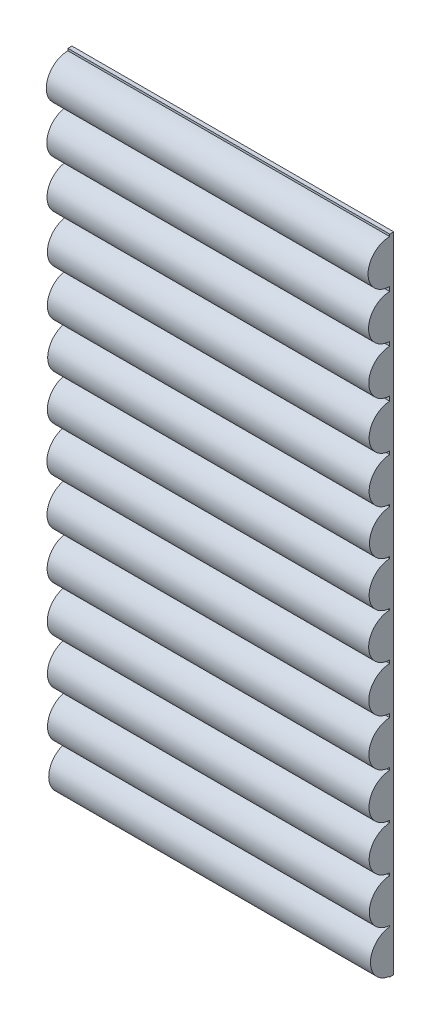
ISO-10303-21;
HEADER;
FILE_DESCRIPTION(('STEP AP214'),'2;1');
FILE_NAME('part.step','',(''),(''),'','','');
FILE_SCHEMA(('AUTOMOTIVE_DESIGN { 1 0 10303 214 1 1 1 1 }'));
ENDSEC;
DATA;
#1=APPLICATION_CONTEXT('core data for automotive mechanical design processes');
#2=APPLICATION_PROTOCOL_DEFINITION('international standard','automotive_design',2000,#1);
#3=PRODUCT_CONTEXT('',#1,'mechanical');
#4=PRODUCT('Part','Part','',(#3));
#5=PRODUCT_RELATED_PRODUCT_CATEGORY('part','',(#4));
#6=PRODUCT_DEFINITION_FORMATION('','',#4);
#7=PRODUCT_DEFINITION_CONTEXT('part definition',#1,'design');
#8=PRODUCT_DEFINITION('design','',#6,#7);
#9=PRODUCT_DEFINITION_SHAPE('','',#8);
#10=(LENGTH_UNIT() NAMED_UNIT(*) SI_UNIT(.MILLI.,.METRE.));
#11=(NAMED_UNIT(*) PLANE_ANGLE_UNIT() SI_UNIT($,.RADIAN.));
#12=(NAMED_UNIT(*) SI_UNIT($,.STERADIAN.) SOLID_ANGLE_UNIT());
#13=UNCERTAINTY_MEASURE_WITH_UNIT(LENGTH_MEASURE(1.E-05),#10,'distance_accuracy_value','');
#14=(GEOMETRIC_REPRESENTATION_CONTEXT(3) GLOBAL_UNCERTAINTY_ASSIGNED_CONTEXT((#13)) GLOBAL_UNIT_ASSIGNED_CONTEXT((#10,
#11,#12)) REPRESENTATION_CONTEXT('',''));
#15=CARTESIAN_POINT('',(0.,0.,0.));
#16=DIRECTION('',(0.,0.,1.));
#17=DIRECTION('',(1.,0.,0.));
#18=AXIS2_PLACEMENT_3D('',#15,#16,#17);
#19=CARTESIAN_POINT('',(0.,0.,0.026));
#20=DIRECTION('',(0.,0.,-1.));
#21=DIRECTION('',(-1.,0.,0.));
#22=AXIS2_PLACEMENT_3D('',#19,#20,#21);
#23=PLANE('',#22);
#24=DIRECTION('',(0.,1.,0.));
#25=VECTOR('',#24,1.);
#26=CARTESIAN_POINT('',(2.08,0.,0.026));
#27=LINE('',#26,#25);
#28=CARTESIAN_POINT('',(2.08,0.,0.026));
#29=VERTEX_POINT('',#28);
#30=CARTESIAN_POINT('',(2.08,0.00484128205017573,0.026));
#31=VERTEX_POINT('',#30);
#32=EDGE_CURVE('E259',#29,#31,#27,.T.);
#33=ORIENTED_EDGE('',*,*,#32,.T.);
#34=DIRECTION('',(-1.,0.,0.));
#35=VECTOR('',#34,1.);
#36=CARTESIAN_POINT('',(2.39228025314519,0.00484128205017573,0.026));
#37=LINE('',#36,#35);
#38=CARTESIAN_POINT('',(0.,0.00484128205017573,0.026));
#39=VERTEX_POINT('',#38);
#40=EDGE_CURVE('E55',#31,#39,#37,.T.);
#41=ORIENTED_EDGE('',*,*,#40,.T.);
#42=DIRECTION('',(0.,-1.,0.));
#43=VECTOR('',#42,1.);
#44=CARTESIAN_POINT('',(0.,0.,0.026));
#45=LINE('',#44,#43);
#46=CARTESIAN_POINT('',(0.,0.,0.026));
#47=VERTEX_POINT('',#46);
#48=EDGE_CURVE('E477',#39,#47,#45,.T.);
#49=ORIENTED_EDGE('',*,*,#48,.T.);
#50=DIRECTION('',(1.,0.,0.));
#51=VECTOR('',#50,1.);
#52=CARTESIAN_POINT('',(0.,0.,0.026));
#53=LINE('',#52,#51);
#54=EDGE_CURVE('E475',#47,#29,#53,.T.);
#55=ORIENTED_EDGE('',*,*,#54,.T.);
#56=EDGE_LOOP('',(#33,#41,#49,#55));
#57=FACE_BOUND('',#56,.T.);
#58=ADVANCED_FACE('F39',(#57),#23,.F.);
#59=CARTESIAN_POINT('',(0.,0.289570039081242,0.026));
#60=VERTEX_POINT('',#59);
#61=CARTESIAN_POINT('',(0.,0.282403177707025,0.026));
#62=VERTEX_POINT('',#61);
#63=EDGE_CURVE('E63',#60,#62,#45,.T.);
#64=ORIENTED_EDGE('',*,*,#63,.T.);
#65=DIRECTION('',(-1.,0.,0.));
#66=VECTOR('',#65,1.);
#67=CARTESIAN_POINT('',(2.39228025314519,0.282403177707025,0.026));
#68=LINE('',#67,#66);
#69=CARTESIAN_POINT('',(2.08,0.282403177707025,0.026));
#70=VERTEX_POINT('',#69);
#71=EDGE_CURVE('E262',#62,#70,#68,.F.);
#72=ORIENTED_EDGE('',*,*,#71,.T.);
#73=CARTESIAN_POINT('',(2.08,0.289570039081242,0.026));
#74=VERTEX_POINT('',#73);
#75=EDGE_CURVE('E250',#70,#74,#27,.T.);
#76=ORIENTED_EDGE('',*,*,#75,.T.);
#77=DIRECTION('',(-1.,0.,0.));
#78=VECTOR('',#77,1.);
#79=CARTESIAN_POINT('',(2.39228025314519,0.289570039081242,0.026));
#80=LINE('',#79,#78);
#81=EDGE_CURVE('E288',#74,#60,#80,.T.);
#82=ORIENTED_EDGE('',*,*,#81,.T.);
#83=EDGE_LOOP('',(#64,#72,#76,#82));
#84=FACE_BOUND('',#83,.T.);
#85=ADVANCED_FACE('F263',(#84),#23,.F.);
#86=CARTESIAN_POINT('',(0.,0.584806109365343,0.026));
#87=VERTEX_POINT('',#86);
#88=CARTESIAN_POINT('',(0.,0.568456082298236,0.026));
#89=VERTEX_POINT('',#88);
#90=EDGE_CURVE('E591',#87,#89,#45,.T.);
#91=ORIENTED_EDGE('',*,*,#90,.T.);
#92=DIRECTION('',(-1.,0.,0.));
#93=VECTOR('',#92,1.);
#94=CARTESIAN_POINT('',(2.39228025314519,0.568456082298236,0.026));
#95=LINE('',#94,#93);
#96=CARTESIAN_POINT('',(2.08,0.568456082298236,0.026));
#97=VERTEX_POINT('',#96);
#98=EDGE_CURVE('E281',#89,#97,#95,.F.);
#99=ORIENTED_EDGE('',*,*,#98,.T.);
#100=CARTESIAN_POINT('',(2.08,0.584806109365343,0.026));
#101=VERTEX_POINT('',#100);
#102=EDGE_CURVE('E260',#97,#101,#27,.T.);
#103=ORIENTED_EDGE('',*,*,#102,.T.);
#104=DIRECTION('',(-1.,0.,0.));
#105=VECTOR('',#104,1.);
#106=CARTESIAN_POINT('',(2.39228025314519,0.584806109365343,0.026));
#107=LINE('',#106,#105);
#108=EDGE_CURVE('E303',#101,#87,#107,.T.);
#109=ORIENTED_EDGE('',*,*,#108,.T.);
#110=EDGE_LOOP('',(#91,#99,#103,#109));
#111=FACE_BOUND('',#110,.T.);
#112=ADVANCED_FACE('F578',(#111),#23,.F.);
#113=CARTESIAN_POINT('',(0.,0.878608154204701,0.026));
#114=VERTEX_POINT('',#113);
#115=CARTESIAN_POINT('',(0.,0.86375738478695,0.026));
#116=VERTEX_POINT('',#115);
#117=EDGE_CURVE('E589',#114,#116,#45,.T.);
#118=ORIENTED_EDGE('',*,*,#117,.T.);
#119=DIRECTION('',(-1.,0.,0.));
#120=VECTOR('',#119,1.);
#121=CARTESIAN_POINT('',(2.39228025314519,0.86375738478695,0.026));
#122=LINE('',#121,#120);
#123=CARTESIAN_POINT('',(2.08,0.86375738478695,0.026));
#124=VERTEX_POINT('',#123);
#125=EDGE_CURVE('E296',#116,#124,#122,.F.);
#126=ORIENTED_EDGE('',*,*,#125,.T.);
#127=CARTESIAN_POINT('',(2.08,0.878608154204701,0.026));
#128=VERTEX_POINT('',#127);
#129=EDGE_CURVE('E569',#124,#128,#27,.T.);
#130=ORIENTED_EDGE('',*,*,#129,.T.);
#131=DIRECTION('',(-1.,0.,0.));
#132=VECTOR('',#131,1.);
#133=CARTESIAN_POINT('',(2.39228025314519,0.878608154204701,0.026));
#134=LINE('',#133,#132);
#135=EDGE_CURVE('E318',#128,#114,#134,.T.);
#136=ORIENTED_EDGE('',*,*,#135,.T.);
#137=EDGE_LOOP('',(#118,#126,#130,#136));
#138=FACE_BOUND('',#137,.T.);
#139=ADVANCED_FACE('F587',(#138),#23,.F.);
#140=CARTESIAN_POINT('',(0.,1.17368885080481,0.026));
#141=VERTEX_POINT('',#140);
#142=CARTESIAN_POINT('',(0.,1.15767194286982,0.026));
#143=VERTEX_POINT('',#142);
#144=EDGE_CURVE('E596',#141,#143,#45,.T.);
#145=ORIENTED_EDGE('',*,*,#144,.T.);
#146=DIRECTION('',(-1.,0.,0.));
#147=VECTOR('',#146,1.);
#148=CARTESIAN_POINT('',(2.39228025314519,1.15767194286982,0.026));
#149=LINE('',#148,#147);
#150=CARTESIAN_POINT('',(2.08,1.15767194286982,0.026));
#151=VERTEX_POINT('',#150);
#152=EDGE_CURVE('E311',#143,#151,#149,.F.);
#153=ORIENTED_EDGE('',*,*,#152,.T.);
#154=CARTESIAN_POINT('',(2.08,1.17368885080481,0.026));
#155=VERTEX_POINT('',#154);
#156=EDGE_CURVE('E565',#151,#155,#27,.T.);
#157=ORIENTED_EDGE('',*,*,#156,.T.);
#158=DIRECTION('',(-1.,0.,0.));
#159=VECTOR('',#158,1.);
#160=CARTESIAN_POINT('',(2.39228025314519,1.17368885080481,0.026));
#161=LINE('',#160,#159);
#162=EDGE_CURVE('E333',#155,#141,#161,.T.);
#163=ORIENTED_EDGE('',*,*,#162,.T.);
#164=EDGE_LOOP('',(#145,#153,#157,#163));
#165=FACE_BOUND('',#164,.T.);
#166=ADVANCED_FACE('F667',(#165),#23,.F.);
#167=CARTESIAN_POINT('',(0.,1.47659323640001,0.026));
#168=VERTEX_POINT('',#167);
#169=CARTESIAN_POINT('',(0.,1.4528024800924,0.026));
#170=VERTEX_POINT('',#169);
#171=EDGE_CURVE('E658',#168,#170,#45,.T.);
#172=ORIENTED_EDGE('',*,*,#171,.T.);
#173=DIRECTION('',(-1.,0.,0.));
#174=VECTOR('',#173,1.);
#175=CARTESIAN_POINT('',(2.39228025314519,1.4528024800924,0.026));
#176=LINE('',#175,#174);
#177=CARTESIAN_POINT('',(2.08,1.4528024800924,0.026));
#178=VERTEX_POINT('',#177);
#179=EDGE_CURVE('E326',#170,#178,#176,.F.);
#180=ORIENTED_EDGE('',*,*,#179,.T.);
#181=CARTESIAN_POINT('',(2.08,1.47659323640001,0.026));
#182=VERTEX_POINT('',#181);
#183=EDGE_CURVE('E561',#178,#182,#27,.T.);
#184=ORIENTED_EDGE('',*,*,#183,.T.);
#185=DIRECTION('',(-1.,0.,0.));
#186=VECTOR('',#185,1.);
#187=CARTESIAN_POINT('',(2.39228025314519,1.47659323640001,0.026));
#188=LINE('',#187,#186);
#189=EDGE_CURVE('E348',#182,#168,#188,.T.);
#190=ORIENTED_EDGE('',*,*,#189,.T.);
#191=EDGE_LOOP('',(#172,#180,#184,#190));
#192=FACE_BOUND('',#191,.T.);
#193=ADVANCED_FACE('F878',(#192),#23,.F.);
#194=CARTESIAN_POINT('',(0.,1.77574322886679,0.026));
#195=VERTEX_POINT('',#194);
#196=CARTESIAN_POINT('',(0.,1.75575949501821,0.026));
#197=VERTEX_POINT('',#196);
#198=EDGE_CURVE('E654',#195,#197,#45,.T.);
#199=ORIENTED_EDGE('',*,*,#198,.T.);
#200=DIRECTION('',(-1.,0.,0.));
#201=VECTOR('',#200,1.);
#202=CARTESIAN_POINT('',(2.39228025314519,1.75575949501821,0.026));
#203=LINE('',#202,#201);
#204=CARTESIAN_POINT('',(2.08,1.75575949501821,0.026));
#205=VERTEX_POINT('',#204);
#206=EDGE_CURVE('E341',#197,#205,#203,.F.);
#207=ORIENTED_EDGE('',*,*,#206,.T.);
#208=CARTESIAN_POINT('',(2.08,1.77574322886679,0.026));
#209=VERTEX_POINT('',#208);
#210=EDGE_CURVE('E557',#205,#209,#27,.T.);
#211=ORIENTED_EDGE('',*,*,#210,.T.);
#212=DIRECTION('',(-1.,0.,0.));
#213=VECTOR('',#212,1.);
#214=CARTESIAN_POINT('',(2.39228025314519,1.77574322886679,0.026));
#215=LINE('',#214,#213);
#216=EDGE_CURVE('E363',#209,#195,#215,.T.);
#217=ORIENTED_EDGE('',*,*,#216,.T.);
#218=EDGE_LOOP('',(#199,#207,#211,#217));
#219=FACE_BOUND('',#218,.T.);
#220=ADVANCED_FACE('F871',(#219),#23,.F.);
#221=CARTESIAN_POINT('',(0.,2.06450520931542,0.026));
#222=VERTEX_POINT('',#221);
#223=CARTESIAN_POINT('',(0.,2.05495401224712,0.026));
#224=VERTEX_POINT('',#223);
#225=EDGE_CURVE('E650',#222,#224,#45,.T.);
#226=ORIENTED_EDGE('',*,*,#225,.T.);
#227=DIRECTION('',(-1.,0.,0.));
#228=VECTOR('',#227,1.);
#229=CARTESIAN_POINT('',(2.39228025314519,2.05495401224712,0.026));
#230=LINE('',#229,#228);
#231=CARTESIAN_POINT('',(2.08,2.05495401224712,0.026));
#232=VERTEX_POINT('',#231);
#233=EDGE_CURVE('E356',#224,#232,#230,.F.);
#234=ORIENTED_EDGE('',*,*,#233,.T.);
#235=CARTESIAN_POINT('',(2.08,2.06450520931542,0.026));
#236=VERTEX_POINT('',#235);
#237=EDGE_CURVE('E553',#232,#236,#27,.T.);
#238=ORIENTED_EDGE('',*,*,#237,.T.);
#239=DIRECTION('',(-1.,0.,0.));
#240=VECTOR('',#239,1.);
#241=CARTESIAN_POINT('',(2.39228025314519,2.06450520931542,0.026));
#242=LINE('',#241,#240);
#243=EDGE_CURVE('E378',#236,#222,#242,.T.);
#244=ORIENTED_EDGE('',*,*,#243,.T.);
#245=EDGE_LOOP('',(#226,#234,#238,#244));
#246=FACE_BOUND('',#245,.T.);
#247=ADVANCED_FACE('F864',(#246),#23,.F.);
#248=CARTESIAN_POINT('',(0.,2.35478484976561,0.026));
#249=VERTEX_POINT('',#248);
#250=CARTESIAN_POINT('',(0.,2.34348924718328,0.026));
#251=VERTEX_POINT('',#250);
#252=EDGE_CURVE('E646',#249,#251,#45,.T.);
#253=ORIENTED_EDGE('',*,*,#252,.T.);
#254=DIRECTION('',(-1.,0.,0.));
#255=VECTOR('',#254,1.);
#256=CARTESIAN_POINT('',(2.39228025314519,2.34348924718328,0.026));
#257=LINE('',#256,#255);
#258=CARTESIAN_POINT('',(2.08,2.34348924718328,0.026));
#259=VERTEX_POINT('',#258);
#260=EDGE_CURVE('E371',#251,#259,#257,.F.);
#261=ORIENTED_EDGE('',*,*,#260,.T.);
#262=CARTESIAN_POINT('',(2.08,2.35478484976561,0.026));
#263=VERTEX_POINT('',#262);
#264=EDGE_CURVE('E549',#259,#263,#27,.T.);
#265=ORIENTED_EDGE('',*,*,#264,.T.);
#266=DIRECTION('',(-1.,0.,0.));
#267=VECTOR('',#266,1.);
#268=CARTESIAN_POINT('',(2.39228025314519,2.35478484976561,0.026));
#269=LINE('',#268,#267);
#270=EDGE_CURVE('E393',#263,#249,#269,.T.);
#271=ORIENTED_EDGE('',*,*,#270,.T.);
#272=EDGE_LOOP('',(#253,#261,#265,#271));
#273=FACE_BOUND('',#272,.T.);
#274=ADVANCED_FACE('F857',(#273),#23,.F.);
#275=CARTESIAN_POINT('',(0.,2.6463125591954,0.026));
#276=VERTEX_POINT('',#275);
#277=CARTESIAN_POINT('',(0.,2.633513578448,0.026));
#278=VERTEX_POINT('',#277);
#279=EDGE_CURVE('E642',#276,#278,#45,.T.);
#280=ORIENTED_EDGE('',*,*,#279,.T.);
#281=DIRECTION('',(-1.,0.,0.));
#282=VECTOR('',#281,1.);
#283=CARTESIAN_POINT('',(2.39228025314519,2.633513578448,0.026));
#284=LINE('',#283,#282);
#285=CARTESIAN_POINT('',(2.08,2.633513578448,0.026));
#286=VERTEX_POINT('',#285);
#287=EDGE_CURVE('E386',#278,#286,#284,.F.);
#288=ORIENTED_EDGE('',*,*,#287,.T.);
#289=CARTESIAN_POINT('',(2.08,2.6463125591954,0.026));
#290=VERTEX_POINT('',#289);
#291=EDGE_CURVE('E545',#286,#290,#27,.T.);
#292=ORIENTED_EDGE('',*,*,#291,.T.);
#293=DIRECTION('',(-1.,0.,0.));
#294=VECTOR('',#293,1.);
#295=CARTESIAN_POINT('',(2.39228025314519,2.6463125591954,0.026));
#296=LINE('',#295,#294);
#297=EDGE_CURVE('E408',#290,#276,#296,.T.);
#298=ORIENTED_EDGE('',*,*,#297,.T.);
#299=EDGE_LOOP('',(#280,#288,#292,#298));
#300=FACE_BOUND('',#299,.T.);
#301=ADVANCED_FACE('F850',(#300),#23,.F.);
#302=CARTESIAN_POINT('',(0.,2.94548481404324,0.026));
#303=VERTEX_POINT('',#302);
#304=CARTESIAN_POINT('',(0.,2.92529659706326,0.026));
#305=VERTEX_POINT('',#304);
#306=EDGE_CURVE('E639',#303,#305,#45,.T.);
#307=ORIENTED_EDGE('',*,*,#306,.T.);
#308=DIRECTION('',(-1.,0.,0.));
#309=VECTOR('',#308,1.);
#310=CARTESIAN_POINT('',(2.39228025314519,2.92529659706326,0.026));
#311=LINE('',#310,#309);
#312=CARTESIAN_POINT('',(2.08,2.92529659706326,0.026));
#313=VERTEX_POINT('',#312);
#314=EDGE_CURVE('E401',#305,#313,#311,.F.);
#315=ORIENTED_EDGE('',*,*,#314,.T.);
#316=CARTESIAN_POINT('',(2.08,2.94548481404324,0.026));
#317=VERTEX_POINT('',#316);
#318=EDGE_CURVE('E541',#313,#317,#27,.T.);
#319=ORIENTED_EDGE('',*,*,#318,.T.);
#320=DIRECTION('',(-1.,0.,0.));
#321=VECTOR('',#320,1.);
#322=CARTESIAN_POINT('',(2.39228025314519,2.94548481404324,0.026));
#323=LINE('',#322,#321);
#324=EDGE_CURVE('E423',#317,#303,#323,.T.);
#325=ORIENTED_EDGE('',*,*,#324,.T.);
#326=EDGE_LOOP('',(#307,#315,#319,#325));
#327=FACE_BOUND('',#326,.T.);
#328=ADVANCED_FACE('F843',(#327),#23,.F.);
#329=CARTESIAN_POINT('',(0.,3.25358622750631,0.026));
#330=VERTEX_POINT('',#329);
#331=CARTESIAN_POINT('',(0.,3.2244688519111,0.026));
#332=VERTEX_POINT('',#331);
#333=EDGE_CURVE('E637',#330,#332,#45,.T.);
#334=ORIENTED_EDGE('',*,*,#333,.T.);
#335=DIRECTION('',(-1.,0.,0.));
#336=VECTOR('',#335,1.);
#337=CARTESIAN_POINT('',(2.39228025314519,3.2244688519111,0.026));
#338=LINE('',#337,#336);
#339=CARTESIAN_POINT('',(2.08,3.2244688519111,0.026));
#340=VERTEX_POINT('',#339);
#341=EDGE_CURVE('E416',#332,#340,#338,.F.);
#342=ORIENTED_EDGE('',*,*,#341,.T.);
#343=CARTESIAN_POINT('',(2.08,3.25358622750631,0.026));
#344=VERTEX_POINT('',#343);
#345=EDGE_CURVE('E537',#340,#344,#27,.T.);
#346=ORIENTED_EDGE('',*,*,#345,.T.);
#347=DIRECTION('',(-1.,0.,0.));
#348=VECTOR('',#347,1.);
#349=CARTESIAN_POINT('',(2.39228025314519,3.25358622750631,0.026));
#350=LINE('',#349,#348);
#351=EDGE_CURVE('E438',#344,#330,#350,.T.);
#352=ORIENTED_EDGE('',*,*,#351,.T.);
#353=EDGE_LOOP('',(#334,#342,#346,#352));
#354=FACE_BOUND('',#353,.T.);
#355=ADVANCED_FACE('F624',(#354),#23,.F.);
#356=CARTESIAN_POINT('',(0.,3.55948320968068,0.026));
#357=VERTEX_POINT('',#356);
#358=CARTESIAN_POINT('',(0.,3.5327524861245,0.026));
#359=VERTEX_POINT('',#358);
#360=EDGE_CURVE('E628',#357,#359,#45,.T.);
#361=ORIENTED_EDGE('',*,*,#360,.T.);
#362=DIRECTION('',(-1.,0.,0.));
#363=VECTOR('',#362,1.);
#364=CARTESIAN_POINT('',(2.39228025314519,3.5327524861245,0.026));
#365=LINE('',#364,#363);
#366=CARTESIAN_POINT('',(2.08,3.5327524861245,0.026));
#367=VERTEX_POINT('',#366);
#368=EDGE_CURVE('E431',#359,#367,#365,.F.);
#369=ORIENTED_EDGE('',*,*,#368,.T.);
#370=CARTESIAN_POINT('',(2.08,3.55948320968068,0.026));
#371=VERTEX_POINT('',#370);
#372=EDGE_CURVE('E534',#367,#371,#27,.T.);
#373=ORIENTED_EDGE('',*,*,#372,.T.);
#374=DIRECTION('',(-1.,0.,0.));
#375=VECTOR('',#374,1.);
#376=CARTESIAN_POINT('',(2.39228025314519,3.55948320968068,0.026));
#377=LINE('',#376,#375);
#378=EDGE_CURVE('E453',#371,#357,#377,.T.);
#379=ORIENTED_EDGE('',*,*,#378,.T.);
#380=EDGE_LOOP('',(#361,#369,#373,#379));
#381=FACE_BOUND('',#380,.T.);
#382=ADVANCED_FACE('F620',(#381),#23,.F.);
#383=CARTESIAN_POINT('',(0.,3.86689167334904,0.026));
#384=VERTEX_POINT('',#383);
#385=CARTESIAN_POINT('',(0.,3.8387304171314,0.026));
#386=VERTEX_POINT('',#385);
#387=EDGE_CURVE('E476',#384,#386,#45,.T.);
#388=ORIENTED_EDGE('',*,*,#387,.T.);
#389=DIRECTION('',(-1.,0.,0.));
#390=VECTOR('',#389,1.);
#391=CARTESIAN_POINT('',(2.39228025314519,3.8387304171314,0.026));
#392=LINE('',#391,#390);
#393=CARTESIAN_POINT('',(2.08,3.8387304171314,0.026));
#394=VERTEX_POINT('',#393);
#395=EDGE_CURVE('E446',#386,#394,#392,.F.);
#396=ORIENTED_EDGE('',*,*,#395,.T.);
#397=CARTESIAN_POINT('',(2.08,3.86689167334904,0.026));
#398=VERTEX_POINT('',#397);
#399=EDGE_CURVE('E531',#394,#398,#27,.T.);
#400=ORIENTED_EDGE('',*,*,#399,.T.);
#401=DIRECTION('',(-1.,0.,0.));
#402=VECTOR('',#401,1.);
#403=CARTESIAN_POINT('',(2.39228025314519,3.86689167334904,0.026));
#404=LINE('',#403,#402);
#405=EDGE_CURVE('E462',#398,#384,#404,.T.);
#406=ORIENTED_EDGE('',*,*,#405,.T.);
#407=EDGE_LOOP('',(#388,#396,#400,#406));
#408=FACE_BOUND('',#407,.T.);
#409=ADVANCED_FACE('F605',(#408),#23,.F.);
#410=CARTESIAN_POINT('',(0.,0.,0.026));
#411=DIRECTION('',(1.,0.,0.));
#412=DIRECTION('',(0.,0.,-1.));
#413=AXIS2_PLACEMENT_3D('',#410,#411,#412);
#414=PLANE('',#413);
#415=ORIENTED_EDGE('',*,*,#48,.F.);
#416=CARTESIAN_POINT('',(0.,0.1436222298786,0.0103910339634849));
#417=DIRECTION('',(-1.,0.,0.));
#418=DIRECTION('',(0.,0.,1.));
#419=AXIS2_PLACEMENT_3D('',#416,#417,#418);
#420=CIRCLE('',#419,0.139655974812698);
#421=EDGE_CURVE('E271',#39,#62,#420,.T.);
#422=ORIENTED_EDGE('',*,*,#421,.T.);
#423=ORIENTED_EDGE('',*,*,#63,.F.);
#424=CARTESIAN_POINT('',(0.,0.429013060689739,0.0182905885064299));
#425=DIRECTION('',(-1.,0.,0.));
#426=DIRECTION('',(0.,0.,1.));
#427=AXIS2_PLACEMENT_3D('',#424,#425,#426);
#428=CIRCLE('',#427,0.139655974812698);
#429=EDGE_CURVE('E278',#60,#89,#428,.T.);
#430=ORIENTED_EDGE('',*,*,#429,.T.);
#431=ORIENTED_EDGE('',*,*,#90,.F.);
#432=CARTESIAN_POINT('',(0.,0.724281747076146,0.0189050873120477));
#433=DIRECTION('',(-1.,0.,0.));
#434=DIRECTION('',(0.,0.,1.));
#435=AXIS2_PLACEMENT_3D('',#432,#433,#434);
#436=CIRCLE('',#435,0.139655974812698);
#437=EDGE_CURVE('E291',#87,#116,#436,.T.);
#438=ORIENTED_EDGE('',*,*,#437,.T.);
#439=ORIENTED_EDGE('',*,*,#117,.F.);
#440=CARTESIAN_POINT('',(0.,1.01814004853726,0.0201142744837723));
#441=DIRECTION('',(-1.,0.,0.));
#442=DIRECTION('',(0.,0.,1.));
#443=AXIS2_PLACEMENT_3D('',#440,#441,#442);
#444=CIRCLE('',#443,0.139655974812698);
#445=EDGE_CURVE('E306',#114,#143,#444,.T.);
#446=ORIENTED_EDGE('',*,*,#445,.T.);
#447=ORIENTED_EDGE('',*,*,#144,.F.);
#448=CARTESIAN_POINT('',(0.,1.31324566544861,0.0207381764222741));
#449=DIRECTION('',(-1.,0.,0.));
#450=DIRECTION('',(0.,0.,1.));
#451=AXIS2_PLACEMENT_3D('',#448,#449,#450);
#452=CIRCLE('',#451,0.139655974812698);
#453=EDGE_CURVE('E321',#141,#170,#452,.T.);
#454=ORIENTED_EDGE('',*,*,#453,.T.);
#455=ORIENTED_EDGE('',*,*,#171,.F.);
#456=CARTESIAN_POINT('',(0.,1.61617636570911,0.0214898655048064));
#457=DIRECTION('',(-1.,0.,0.));
#458=DIRECTION('',(0.,0.,1.));
#459=AXIS2_PLACEMENT_3D('',#456,#457,#458);
#460=CIRCLE('',#459,0.139655974812698);
#461=EDGE_CURVE('E336',#168,#197,#460,.T.);
#462=ORIENTED_EDGE('',*,*,#461,.T.);
#463=ORIENTED_EDGE('',*,*,#198,.F.);
#464=CARTESIAN_POINT('',(0.,1.91534862055696,0.0222415545873387));
#465=DIRECTION('',(-1.,0.,0.));
#466=DIRECTION('',(0.,0.,1.));
#467=AXIS2_PLACEMENT_3D('',#464,#465,#466);
#468=CIRCLE('',#467,0.139655974812698);
#469=EDGE_CURVE('E351',#195,#224,#468,.T.);
#470=ORIENTED_EDGE('',*,*,#469,.T.);
#471=ORIENTED_EDGE('',*,*,#225,.F.);
#472=CARTESIAN_POINT('',(0.,2.20399722824935,0.0192347982572096));
#473=DIRECTION('',(-1.,0.,0.));
#474=DIRECTION('',(0.,0.,1.));
#475=AXIS2_PLACEMENT_3D('',#472,#473,#474);
#476=CIRCLE('',#475,0.139655974812698);
#477=EDGE_CURVE('E366',#222,#251,#476,.T.);
#478=ORIENTED_EDGE('',*,*,#477,.T.);
#479=ORIENTED_EDGE('',*,*,#252,.F.);
#480=CARTESIAN_POINT('',(0.,2.49414921410681,0.0169797310096127));
#481=DIRECTION('',(-1.,0.,0.));
#482=DIRECTION('',(0.,0.,1.));
#483=AXIS2_PLACEMENT_3D('',#480,#481,#482);
#484=CIRCLE('',#483,0.139655974812698);
#485=EDGE_CURVE('E381',#249,#278,#484,.T.);
#486=ORIENTED_EDGE('',*,*,#485,.T.);
#487=ORIENTED_EDGE('',*,*,#279,.F.);
#488=CARTESIAN_POINT('',(0.,2.78580457812933,0.0192347982572096));
#489=DIRECTION('',(-1.,0.,0.));
#490=DIRECTION('',(0.,0.,1.));
#491=AXIS2_PLACEMENT_3D('',#488,#489,#490);
#492=CIRCLE('',#491,0.139655974812698);
#493=EDGE_CURVE('E396',#276,#305,#492,.T.);
#494=ORIENTED_EDGE('',*,*,#493,.T.);
#495=ORIENTED_EDGE('',*,*,#306,.F.);
#496=CARTESIAN_POINT('',(0.,3.08497683297717,0.0192347982572096));
#497=DIRECTION('',(-1.,0.,0.));
#498=DIRECTION('',(0.,0.,1.));
#499=AXIS2_PLACEMENT_3D('',#496,#497,#498);
#500=CIRCLE('',#499,0.139655974812698);
#501=EDGE_CURVE('E411',#303,#332,#500,.T.);
#502=ORIENTED_EDGE('',*,*,#501,.T.);
#503=ORIENTED_EDGE('',*,*,#333,.F.);
#504=CARTESIAN_POINT('',(0.,3.3931693568154,0.0214898655048065));
#505=DIRECTION('',(-1.,0.,0.));
#506=DIRECTION('',(0.,0.,1.));
#507=AXIS2_PLACEMENT_3D('',#504,#505,#506);
#508=CIRCLE('',#507,0.139655974812698);
#509=EDGE_CURVE('E426',#330,#359,#508,.T.);
#510=ORIENTED_EDGE('',*,*,#509,.T.);
#511=ORIENTED_EDGE('',*,*,#360,.F.);
#512=CARTESIAN_POINT('',(0.,3.69910681340604,0.022993243669871));
#513=DIRECTION('',(-1.,0.,0.));
#514=DIRECTION('',(0.,0.,1.));
#515=AXIS2_PLACEMENT_3D('',#512,#513,#514);
#516=CIRCLE('',#515,0.139655974812698);
#517=EDGE_CURVE('E441',#357,#386,#516,.T.);
#518=ORIENTED_EDGE('',*,*,#517,.T.);
#519=ORIENTED_EDGE('',*,*,#387,.F.);
#520=CARTESIAN_POINT('',(0.,4.00654764816174,0.026));
#521=DIRECTION('',(-1.,0.,0.));
#522=DIRECTION('',(0.,0.,1.));
#523=AXIS2_PLACEMENT_3D('',#520,#521,#522);
#524=CIRCLE('',#523,0.139655974812698);
#525=CARTESIAN_POINT('',(0.,4.14620362297444,0.026));
#526=VERTEX_POINT('',#525);
#527=EDGE_CURVE('E456',#384,#526,#524,.T.);
#528=ORIENTED_EDGE('',*,*,#527,.T.);
#529=CARTESIAN_POINT('',(0.,4.16,0.026));
#530=VERTEX_POINT('',#529);
#531=EDGE_CURVE('E472',#530,#526,#45,.T.);
#532=ORIENTED_EDGE('',*,*,#531,.F.);
#533=DIRECTION('',(0.,0.,-1.));
#534=VECTOR('',#533,1.);
#535=CARTESIAN_POINT('',(0.,4.16,0.026));
#536=LINE('',#535,#534);
#537=CARTESIAN_POINT('',(0.,4.16,0.));
#538=VERTEX_POINT('',#537);
#539=EDGE_CURVE('E485',#530,#538,#536,.T.);
#540=ORIENTED_EDGE('',*,*,#539,.T.);
#541=DIRECTION('',(0.,-1.,0.));
#542=VECTOR('',#541,1.);
#543=CARTESIAN_POINT('',(0.,0.,0.));
#544=LINE('',#543,#542);
#545=CARTESIAN_POINT('',(0.,0.,0.));
#546=VERTEX_POINT('',#545);
#547=EDGE_CURVE('E461',#538,#546,#544,.T.);
#548=ORIENTED_EDGE('',*,*,#547,.T.);
#549=DIRECTION('',(0.,0.,-1.));
#550=VECTOR('',#549,1.);
#551=CARTESIAN_POINT('',(0.,0.,0.026));
#552=LINE('',#551,#550);
#553=EDGE_CURVE('E11',#47,#546,#552,.T.);
#554=ORIENTED_EDGE('',*,*,#553,.F.);
#555=EDGE_LOOP('',(#415,#422,#423,#430,#431,#438,#439,#446,#447,#454,#455,#462,#463,#470,#471,
#478,#479,#486,#487,#494,#495,#502,#503,#510,#511,#518,#519,#528,#532,#540,#548,#554));
#556=FACE_BOUND('',#555,.T.);
#557=ADVANCED_FACE('F41',(#556),#414,.F.);
#558=CARTESIAN_POINT('',(0.,0.,0.026));
#559=DIRECTION('',(0.,1.,0.));
#560=DIRECTION('',(0.,0.,1.));
#561=AXIS2_PLACEMENT_3D('',#558,#559,#560);
#562=PLANE('',#561);
#563=DIRECTION('',(1.,0.,0.));
#564=VECTOR('',#563,1.);
#565=CARTESIAN_POINT('',(0.,0.,0.));
#566=LINE('',#565,#564);
#567=CARTESIAN_POINT('',(2.08,0.,0.));
#568=VERTEX_POINT('',#567);
#569=EDGE_CURVE('E489',#546,#568,#566,.T.);
#570=ORIENTED_EDGE('',*,*,#569,.T.);
#571=DIRECTION('',(0.,0.,-1.));
#572=VECTOR('',#571,1.);
#573=CARTESIAN_POINT('',(2.08,0.,0.026));
#574=LINE('',#573,#572);
#575=EDGE_CURVE('E48',#29,#568,#574,.T.);
#576=ORIENTED_EDGE('',*,*,#575,.F.);
#577=ORIENTED_EDGE('',*,*,#54,.F.);
#578=ORIENTED_EDGE('',*,*,#553,.T.);
#579=EDGE_LOOP('',(#570,#576,#577,#578));
#580=FACE_BOUND('',#579,.T.);
#581=ADVANCED_FACE('F598',(#580),#562,.F.);
#582=CARTESIAN_POINT('',(2.08,0.,0.026));
#583=DIRECTION('',(-1.,0.,0.));
#584=DIRECTION('',(0.,0.,1.));
#585=AXIS2_PLACEMENT_3D('',#582,#583,#584);
#586=PLANE('',#585);
#587=ORIENTED_EDGE('',*,*,#75,.F.);
#588=CARTESIAN_POINT('',(2.08,0.1436222298786,0.0103910339634849));
#589=DIRECTION('',(-1.,0.,0.));
#590=DIRECTION('',(0.,0.,1.));
#591=AXIS2_PLACEMENT_3D('',#588,#589,#590);
#592=CIRCLE('',#591,0.139655974812698);
#593=EDGE_CURVE('E254',#70,#31,#592,.F.);
#594=ORIENTED_EDGE('',*,*,#593,.T.);
#595=ORIENTED_EDGE('',*,*,#32,.F.);
#596=ORIENTED_EDGE('',*,*,#575,.T.);
#597=DIRECTION('',(0.,1.,0.));
#598=VECTOR('',#597,1.);
#599=CARTESIAN_POINT('',(2.08,0.,0.));
#600=LINE('',#599,#598);
#601=CARTESIAN_POINT('',(2.08,4.16,0.));
#602=VERTEX_POINT('',#601);
#603=EDGE_CURVE('E492',#568,#602,#600,.T.);
#604=ORIENTED_EDGE('',*,*,#603,.T.);
#605=DIRECTION('',(0.,0.,-1.));
#606=VECTOR('',#605,1.);
#607=CARTESIAN_POINT('',(2.08,4.16,0.026));
#608=LINE('',#607,#606);
#609=CARTESIAN_POINT('',(2.08,4.16,0.026));
#610=VERTEX_POINT('',#609);
#611=EDGE_CURVE('E501',#610,#602,#608,.T.);
#612=ORIENTED_EDGE('',*,*,#611,.F.);
#613=CARTESIAN_POINT('',(2.08,4.14620362297444,0.026));
#614=VERTEX_POINT('',#613);
#615=EDGE_CURVE('E479',#614,#610,#27,.T.);
#616=ORIENTED_EDGE('',*,*,#615,.F.);
#617=CARTESIAN_POINT('',(2.08,4.00654764816174,0.026));
#618=DIRECTION('',(-1.,0.,0.));
#619=DIRECTION('',(0.,0.,1.));
#620=AXIS2_PLACEMENT_3D('',#617,#618,#619);
#621=CIRCLE('',#620,0.139655974812698);
#622=EDGE_CURVE('E457',#614,#398,#621,.F.);
#623=ORIENTED_EDGE('',*,*,#622,.T.);
#624=ORIENTED_EDGE('',*,*,#399,.F.);
#625=CARTESIAN_POINT('',(2.08,3.69910681340604,0.022993243669871));
#626=DIRECTION('',(-1.,0.,0.));
#627=DIRECTION('',(0.,0.,1.));
#628=AXIS2_PLACEMENT_3D('',#625,#626,#627);
#629=CIRCLE('',#628,0.139655974812698);
#630=EDGE_CURVE('E442',#394,#371,#629,.F.);
#631=ORIENTED_EDGE('',*,*,#630,.T.);
#632=ORIENTED_EDGE('',*,*,#372,.F.);
#633=CARTESIAN_POINT('',(2.08,3.3931693568154,0.0214898655048065));
#634=DIRECTION('',(-1.,0.,0.));
#635=DIRECTION('',(0.,0.,1.));
#636=AXIS2_PLACEMENT_3D('',#633,#634,#635);
#637=CIRCLE('',#636,0.139655974812698);
#638=EDGE_CURVE('E427',#367,#344,#637,.F.);
#639=ORIENTED_EDGE('',*,*,#638,.T.);
#640=ORIENTED_EDGE('',*,*,#345,.F.);
#641=CARTESIAN_POINT('',(2.08,3.08497683297717,0.0192347982572096));
#642=DIRECTION('',(-1.,0.,0.));
#643=DIRECTION('',(0.,0.,1.));
#644=AXIS2_PLACEMENT_3D('',#641,#642,#643);
#645=CIRCLE('',#644,0.139655974812698);
#646=EDGE_CURVE('E412',#340,#317,#645,.F.);
#647=ORIENTED_EDGE('',*,*,#646,.T.);
#648=ORIENTED_EDGE('',*,*,#318,.F.);
#649=CARTESIAN_POINT('',(2.08,2.78580457812933,0.0192347982572096));
#650=DIRECTION('',(-1.,0.,0.));
#651=DIRECTION('',(0.,0.,1.));
#652=AXIS2_PLACEMENT_3D('',#649,#650,#651);
#653=CIRCLE('',#652,0.139655974812698);
#654=EDGE_CURVE('E397',#313,#290,#653,.F.);
#655=ORIENTED_EDGE('',*,*,#654,.T.);
#656=ORIENTED_EDGE('',*,*,#291,.F.);
#657=CARTESIAN_POINT('',(2.08,2.49414921410681,0.0169797310096127));
#658=DIRECTION('',(-1.,0.,0.));
#659=DIRECTION('',(0.,0.,1.));
#660=AXIS2_PLACEMENT_3D('',#657,#658,#659);
#661=CIRCLE('',#660,0.139655974812698);
#662=EDGE_CURVE('E382',#286,#263,#661,.F.);
#663=ORIENTED_EDGE('',*,*,#662,.T.);
#664=ORIENTED_EDGE('',*,*,#264,.F.);
#665=CARTESIAN_POINT('',(2.08,2.20399722824935,0.0192347982572096));
#666=DIRECTION('',(-1.,0.,0.));
#667=DIRECTION('',(0.,0.,1.));
#668=AXIS2_PLACEMENT_3D('',#665,#666,#667);
#669=CIRCLE('',#668,0.139655974812698);
#670=EDGE_CURVE('E367',#259,#236,#669,.F.);
#671=ORIENTED_EDGE('',*,*,#670,.T.);
#672=ORIENTED_EDGE('',*,*,#237,.F.);
#673=CARTESIAN_POINT('',(2.08,1.91534862055696,0.0222415545873387));
#674=DIRECTION('',(-1.,0.,0.));
#675=DIRECTION('',(0.,0.,1.));
#676=AXIS2_PLACEMENT_3D('',#673,#674,#675);
#677=CIRCLE('',#676,0.139655974812698);
#678=EDGE_CURVE('E352',#232,#209,#677,.F.);
#679=ORIENTED_EDGE('',*,*,#678,.T.);
#680=ORIENTED_EDGE('',*,*,#210,.F.);
#681=CARTESIAN_POINT('',(2.08,1.61617636570911,0.0214898655048064));
#682=DIRECTION('',(-1.,0.,0.));
#683=DIRECTION('',(0.,0.,1.));
#684=AXIS2_PLACEMENT_3D('',#681,#682,#683);
#685=CIRCLE('',#684,0.139655974812698);
#686=EDGE_CURVE('E337',#205,#182,#685,.F.);
#687=ORIENTED_EDGE('',*,*,#686,.T.);
#688=ORIENTED_EDGE('',*,*,#183,.F.);
#689=CARTESIAN_POINT('',(2.08,1.31324566544861,0.0207381764222741));
#690=DIRECTION('',(-1.,0.,0.));
#691=DIRECTION('',(0.,0.,1.));
#692=AXIS2_PLACEMENT_3D('',#689,#690,#691);
#693=CIRCLE('',#692,0.139655974812698);
#694=EDGE_CURVE('E322',#178,#155,#693,.F.);
#695=ORIENTED_EDGE('',*,*,#694,.T.);
#696=ORIENTED_EDGE('',*,*,#156,.F.);
#697=CARTESIAN_POINT('',(2.08,1.01814004853726,0.0201142744837723));
#698=DIRECTION('',(-1.,0.,0.));
#699=DIRECTION('',(0.,0.,1.));
#700=AXIS2_PLACEMENT_3D('',#697,#698,#699);
#701=CIRCLE('',#700,0.139655974812698);
#702=EDGE_CURVE('E307',#151,#128,#701,.F.);
#703=ORIENTED_EDGE('',*,*,#702,.T.);
#704=ORIENTED_EDGE('',*,*,#129,.F.);
#705=CARTESIAN_POINT('',(2.08,0.724281747076146,0.0189050873120477));
#706=DIRECTION('',(-1.,0.,0.));
#707=DIRECTION('',(0.,0.,1.));
#708=AXIS2_PLACEMENT_3D('',#705,#706,#707);
#709=CIRCLE('',#708,0.139655974812698);
#710=EDGE_CURVE('E292',#124,#101,#709,.F.);
#711=ORIENTED_EDGE('',*,*,#710,.T.);
#712=ORIENTED_EDGE('',*,*,#102,.F.);
#713=CARTESIAN_POINT('',(2.08,0.429013060689739,0.0182905885064299));
#714=DIRECTION('',(-1.,0.,0.));
#715=DIRECTION('',(0.,0.,1.));
#716=AXIS2_PLACEMENT_3D('',#713,#714,#715);
#717=CIRCLE('',#716,0.139655974812698);
#718=EDGE_CURVE('E256',#97,#74,#717,.F.);
#719=ORIENTED_EDGE('',*,*,#718,.T.);
#720=EDGE_LOOP('',(#587,#594,#595,#596,#604,#612,#616,#623,#624,#631,#632,#639,#640,#647,#648,
#655,#656,#663,#664,#671,#672,#679,#680,#687,#688,#695,#696,#703,#704,#711,#712,#719));
#721=FACE_BOUND('',#720,.T.);
#722=ADVANCED_FACE('F251',(#721),#586,.F.);
#723=CARTESIAN_POINT('',(0.,4.16,0.026));
#724=DIRECTION('',(0.,-1.,0.));
#725=DIRECTION('',(0.,0.,-1.));
#726=AXIS2_PLACEMENT_3D('',#723,#724,#725);
#727=PLANE('',#726);
#728=DIRECTION('',(-1.,0.,0.));
#729=VECTOR('',#728,1.);
#730=CARTESIAN_POINT('',(0.,4.16,0.));
#731=LINE('',#730,#729);
#732=EDGE_CURVE('E495',#602,#538,#731,.T.);
#733=ORIENTED_EDGE('',*,*,#732,.T.);
#734=ORIENTED_EDGE('',*,*,#539,.F.);
#735=DIRECTION('',(-1.,0.,0.));
#736=VECTOR('',#735,1.);
#737=CARTESIAN_POINT('',(0.,4.16,0.026));
#738=LINE('',#737,#736);
#739=EDGE_CURVE('E482',#610,#530,#738,.T.);
#740=ORIENTED_EDGE('',*,*,#739,.F.);
#741=ORIENTED_EDGE('',*,*,#611,.T.);
#742=EDGE_LOOP('',(#733,#734,#740,#741));
#743=FACE_BOUND('',#742,.T.);
#744=ADVANCED_FACE('F517',(#743),#727,.F.);
#745=ORIENTED_EDGE('',*,*,#531,.T.);
#746=DIRECTION('',(-1.,0.,0.));
#747=VECTOR('',#746,1.);
#748=CARTESIAN_POINT('',(2.39228025314519,4.14620362297444,0.026));
#749=LINE('',#748,#747);
#750=EDGE_CURVE('E466',#614,#526,#749,.T.);
#751=ORIENTED_EDGE('',*,*,#750,.F.);
#752=ORIENTED_EDGE('',*,*,#615,.T.);
#753=ORIENTED_EDGE('',*,*,#739,.T.);
#754=EDGE_LOOP('',(#745,#751,#752,#753));
#755=FACE_BOUND('',#754,.T.);
#756=ADVANCED_FACE('F526',(#755),#23,.F.);
#757=CARTESIAN_POINT('',(0.,0.,0.));
#758=DIRECTION('',(0.,0.,-1.));
#759=DIRECTION('',(-1.,0.,0.));
#760=AXIS2_PLACEMENT_3D('',#757,#758,#759);
#761=PLANE('',#760);
#762=ORIENTED_EDGE('',*,*,#547,.F.);
#763=ORIENTED_EDGE('',*,*,#732,.F.);
#764=ORIENTED_EDGE('',*,*,#603,.F.);
#765=ORIENTED_EDGE('',*,*,#569,.F.);
#766=EDGE_LOOP('',(#762,#763,#764,#765));
#767=FACE_BOUND('',#766,.T.);
#768=ADVANCED_FACE('F514',(#767),#761,.T.);
#769=CARTESIAN_POINT('',(2.39228025314519,4.00654764816174,0.026));
#770=DIRECTION('',(-1.,0.,0.));
#771=DIRECTION('',(0.,0.,1.));
#772=AXIS2_PLACEMENT_3D('',#769,#770,#771);
#773=CYLINDRICAL_SURFACE('',#772,0.139655974812698);
#774=ORIENTED_EDGE('',*,*,#622,.F.);
#775=ORIENTED_EDGE('',*,*,#750,.T.);
#776=ORIENTED_EDGE('',*,*,#527,.F.);
#777=ORIENTED_EDGE('',*,*,#405,.F.);
#778=EDGE_LOOP('',(#774,#775,#776,#777));
#779=FACE_BOUND('',#778,.T.);
#780=ADVANCED_FACE('F529',(#779),#773,.T.);
#781=CARTESIAN_POINT('',(2.39228025314519,3.69910681340604,0.022993243669871));
#782=DIRECTION('',(-1.,0.,0.));
#783=DIRECTION('',(0.,0.,1.));
#784=AXIS2_PLACEMENT_3D('',#781,#782,#783);
#785=CYLINDRICAL_SURFACE('',#784,0.139655974812698);
#786=ORIENTED_EDGE('',*,*,#378,.F.);
#787=ORIENTED_EDGE('',*,*,#630,.F.);
#788=ORIENTED_EDGE('',*,*,#395,.F.);
#789=ORIENTED_EDGE('',*,*,#517,.F.);
#790=EDGE_LOOP('',(#786,#787,#788,#789));
#791=FACE_BOUND('',#790,.T.);
#792=ADVANCED_FACE('F631',(#791),#785,.T.);
#793=CARTESIAN_POINT('',(2.39228025314519,3.3931693568154,0.0214898655048065));
#794=DIRECTION('',(-1.,0.,0.));
#795=DIRECTION('',(0.,0.,1.));
#796=AXIS2_PLACEMENT_3D('',#793,#794,#795);
#797=CYLINDRICAL_SURFACE('',#796,0.139655974812698);
#798=ORIENTED_EDGE('',*,*,#351,.F.);
#799=ORIENTED_EDGE('',*,*,#638,.F.);
#800=ORIENTED_EDGE('',*,*,#368,.F.);
#801=ORIENTED_EDGE('',*,*,#509,.F.);
#802=EDGE_LOOP('',(#798,#799,#800,#801));
#803=FACE_BOUND('',#802,.T.);
#804=ADVANCED_FACE('F707',(#803),#797,.T.);
#805=CARTESIAN_POINT('',(2.39228025314519,3.08497683297717,0.0192347982572096));
#806=DIRECTION('',(-1.,0.,0.));
#807=DIRECTION('',(0.,0.,1.));
#808=AXIS2_PLACEMENT_3D('',#805,#806,#807);
#809=CYLINDRICAL_SURFACE('',#808,0.139655974812698);
#810=ORIENTED_EDGE('',*,*,#324,.F.);
#811=ORIENTED_EDGE('',*,*,#646,.F.);
#812=ORIENTED_EDGE('',*,*,#341,.F.);
#813=ORIENTED_EDGE('',*,*,#501,.F.);
#814=EDGE_LOOP('',(#810,#811,#812,#813));
#815=FACE_BOUND('',#814,.T.);
#816=ADVANCED_FACE('F703',(#815),#809,.T.);
#817=CARTESIAN_POINT('',(2.39228025314519,2.78580457812933,0.0192347982572096));
#818=DIRECTION('',(-1.,0.,0.));
#819=DIRECTION('',(0.,0.,1.));
#820=AXIS2_PLACEMENT_3D('',#817,#818,#819);
#821=CYLINDRICAL_SURFACE('',#820,0.139655974812698);
#822=ORIENTED_EDGE('',*,*,#297,.F.);
#823=ORIENTED_EDGE('',*,*,#654,.F.);
#824=ORIENTED_EDGE('',*,*,#314,.F.);
#825=ORIENTED_EDGE('',*,*,#493,.F.);
#826=EDGE_LOOP('',(#822,#823,#824,#825));
#827=FACE_BOUND('',#826,.T.);
#828=ADVANCED_FACE('F699',(#827),#821,.T.);
#829=CARTESIAN_POINT('',(2.39228025314519,2.49414921410681,0.0169797310096127));
#830=DIRECTION('',(-1.,0.,0.));
#831=DIRECTION('',(0.,0.,1.));
#832=AXIS2_PLACEMENT_3D('',#829,#830,#831);
#833=CYLINDRICAL_SURFACE('',#832,0.139655974812698);
#834=ORIENTED_EDGE('',*,*,#270,.F.);
#835=ORIENTED_EDGE('',*,*,#662,.F.);
#836=ORIENTED_EDGE('',*,*,#287,.F.);
#837=ORIENTED_EDGE('',*,*,#485,.F.);
#838=EDGE_LOOP('',(#834,#835,#836,#837));
#839=FACE_BOUND('',#838,.T.);
#840=ADVANCED_FACE('F695',(#839),#833,.T.);
#841=CARTESIAN_POINT('',(2.39228025314519,2.20399722824935,0.0192347982572096));
#842=DIRECTION('',(-1.,0.,0.));
#843=DIRECTION('',(0.,0.,1.));
#844=AXIS2_PLACEMENT_3D('',#841,#842,#843);
#845=CYLINDRICAL_SURFACE('',#844,0.139655974812698);
#846=ORIENTED_EDGE('',*,*,#243,.F.);
#847=ORIENTED_EDGE('',*,*,#670,.F.);
#848=ORIENTED_EDGE('',*,*,#260,.F.);
#849=ORIENTED_EDGE('',*,*,#477,.F.);
#850=EDGE_LOOP('',(#846,#847,#848,#849));
#851=FACE_BOUND('',#850,.T.);
#852=ADVANCED_FACE('F691',(#851),#845,.T.);
#853=CARTESIAN_POINT('',(2.39228025314519,1.91534862055696,0.0222415545873387));
#854=DIRECTION('',(-1.,0.,0.));
#855=DIRECTION('',(0.,0.,1.));
#856=AXIS2_PLACEMENT_3D('',#853,#854,#855);
#857=CYLINDRICAL_SURFACE('',#856,0.139655974812698);
#858=ORIENTED_EDGE('',*,*,#216,.F.);
#859=ORIENTED_EDGE('',*,*,#678,.F.);
#860=ORIENTED_EDGE('',*,*,#233,.F.);
#861=ORIENTED_EDGE('',*,*,#469,.F.);
#862=EDGE_LOOP('',(#858,#859,#860,#861));
#863=FACE_BOUND('',#862,.T.);
#864=ADVANCED_FACE('F687',(#863),#857,.T.);
#865=CARTESIAN_POINT('',(2.39228025314519,1.61617636570911,0.0214898655048064));
#866=DIRECTION('',(-1.,0.,0.));
#867=DIRECTION('',(0.,0.,1.));
#868=AXIS2_PLACEMENT_3D('',#865,#866,#867);
#869=CYLINDRICAL_SURFACE('',#868,0.139655974812698);
#870=ORIENTED_EDGE('',*,*,#189,.F.);
#871=ORIENTED_EDGE('',*,*,#686,.F.);
#872=ORIENTED_EDGE('',*,*,#206,.F.);
#873=ORIENTED_EDGE('',*,*,#461,.F.);
#874=EDGE_LOOP('',(#870,#871,#872,#873));
#875=FACE_BOUND('',#874,.T.);
#876=ADVANCED_FACE('F680',(#875),#869,.T.);
#877=CARTESIAN_POINT('',(2.39228025314519,1.31324566544861,0.0207381764222741));
#878=DIRECTION('',(-1.,0.,0.));
#879=DIRECTION('',(0.,0.,1.));
#880=AXIS2_PLACEMENT_3D('',#877,#878,#879);
#881=CYLINDRICAL_SURFACE('',#880,0.139655974812698);
#882=ORIENTED_EDGE('',*,*,#162,.F.);
#883=ORIENTED_EDGE('',*,*,#694,.F.);
#884=ORIENTED_EDGE('',*,*,#179,.F.);
#885=ORIENTED_EDGE('',*,*,#453,.F.);
#886=EDGE_LOOP('',(#882,#883,#884,#885));
#887=FACE_BOUND('',#886,.T.);
#888=ADVANCED_FACE('F672',(#887),#881,.T.);
#889=CARTESIAN_POINT('',(2.39228025314519,1.01814004853726,0.0201142744837723));
#890=DIRECTION('',(-1.,0.,0.));
#891=DIRECTION('',(0.,0.,1.));
#892=AXIS2_PLACEMENT_3D('',#889,#890,#891);
#893=CYLINDRICAL_SURFACE('',#892,0.139655974812698);
#894=ORIENTED_EDGE('',*,*,#135,.F.);
#895=ORIENTED_EDGE('',*,*,#702,.F.);
#896=ORIENTED_EDGE('',*,*,#152,.F.);
#897=ORIENTED_EDGE('',*,*,#445,.F.);
#898=EDGE_LOOP('',(#894,#895,#896,#897));
#899=FACE_BOUND('',#898,.T.);
#900=ADVANCED_FACE('F670',(#899),#893,.T.);
#901=CARTESIAN_POINT('',(2.39228025314519,0.724281747076146,0.0189050873120477));
#902=DIRECTION('',(-1.,0.,0.));
#903=DIRECTION('',(0.,0.,1.));
#904=AXIS2_PLACEMENT_3D('',#901,#902,#903);
#905=CYLINDRICAL_SURFACE('',#904,0.139655974812698);
#906=ORIENTED_EDGE('',*,*,#108,.F.);
#907=ORIENTED_EDGE('',*,*,#710,.F.);
#908=ORIENTED_EDGE('',*,*,#125,.F.);
#909=ORIENTED_EDGE('',*,*,#437,.F.);
#910=EDGE_LOOP('',(#906,#907,#908,#909));
#911=FACE_BOUND('',#910,.T.);
#912=ADVANCED_FACE('F584',(#911),#905,.T.);
#913=CARTESIAN_POINT('',(2.39228025314519,0.429013060689739,0.0182905885064299));
#914=DIRECTION('',(-1.,0.,0.));
#915=DIRECTION('',(0.,0.,1.));
#916=AXIS2_PLACEMENT_3D('',#913,#914,#915);
#917=CYLINDRICAL_SURFACE('',#916,0.139655974812698);
#918=ORIENTED_EDGE('',*,*,#81,.F.);
#919=ORIENTED_EDGE('',*,*,#718,.F.);
#920=ORIENTED_EDGE('',*,*,#98,.F.);
#921=ORIENTED_EDGE('',*,*,#429,.F.);
#922=EDGE_LOOP('',(#918,#919,#920,#921));
#923=FACE_BOUND('',#922,.T.);
#924=ADVANCED_FACE('F678',(#923),#917,.T.);
#925=CARTESIAN_POINT('',(2.39228025314519,0.1436222298786,0.0103910339634849));
#926=DIRECTION('',(-1.,0.,0.));
#927=DIRECTION('',(0.,0.,1.));
#928=AXIS2_PLACEMENT_3D('',#925,#926,#927);
#929=CYLINDRICAL_SURFACE('',#928,0.139655974812698);
#930=ORIENTED_EDGE('',*,*,#40,.F.);
#931=ORIENTED_EDGE('',*,*,#593,.F.);
#932=ORIENTED_EDGE('',*,*,#71,.F.);
#933=ORIENTED_EDGE('',*,*,#421,.F.);
#934=EDGE_LOOP('',(#930,#931,#932,#933));
#935=FACE_BOUND('',#934,.T.);
#936=ADVANCED_FACE('F269',(#935),#929,.T.);
#937=CLOSED_SHELL('',(#58,#85,#112,#139,#166,#193,#220,#247,#274,#301,#328,#355,#382,#409,#557,
#581,#722,#744,#756,#768,#780,#792,#804,#816,#828,#840,#852,#864,#876,#888,#900,#912,#924,#936));
#938=MANIFOLD_SOLID_BREP('B2',#937);
#939=ADVANCED_BREP_SHAPE_REPRESENTATION('',(#18,#938),#14);
#940=SHAPE_DEFINITION_REPRESENTATION(#9,#939);
ENDSEC;
END-ISO-10303-21;
